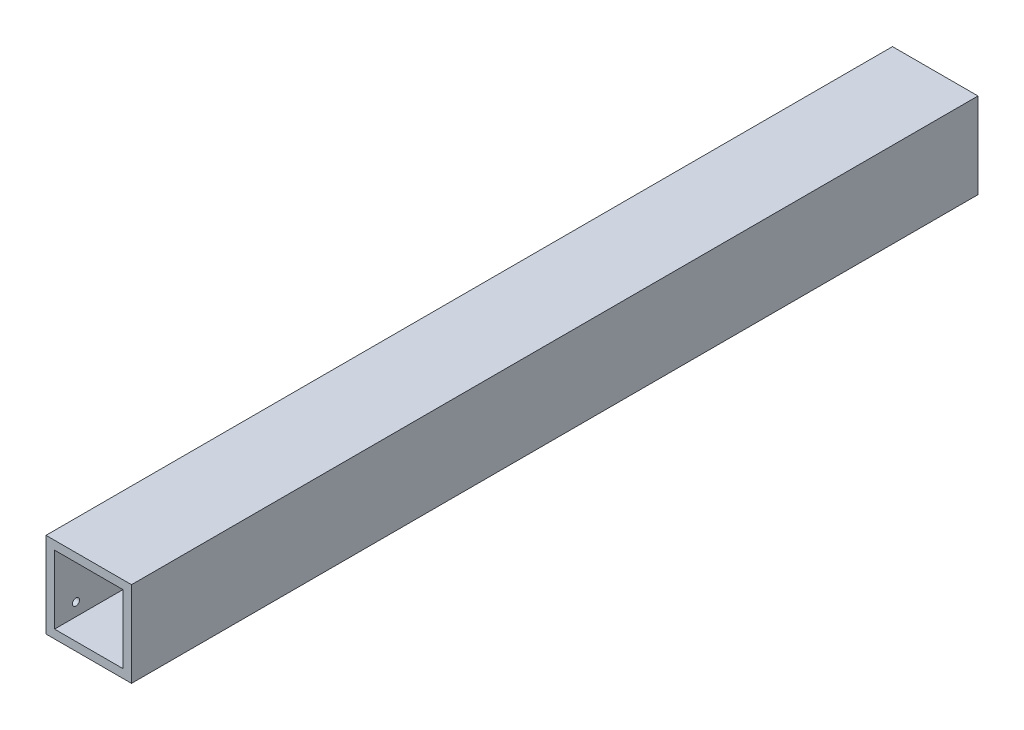
ISO-10303-21;
HEADER;
FILE_DESCRIPTION(('STEP AP214'),'2;1');
FILE_NAME('part.step','',(''),(''),'','','');
FILE_SCHEMA(('AUTOMOTIVE_DESIGN { 1 0 10303 214 1 1 1 1 }'));
ENDSEC;
DATA;
#1=APPLICATION_CONTEXT('core data for automotive mechanical design processes');
#2=APPLICATION_PROTOCOL_DEFINITION('international standard','automotive_design',2000,#1);
#3=PRODUCT_CONTEXT('',#1,'mechanical');
#4=PRODUCT('Part','Part','',(#3));
#5=PRODUCT_RELATED_PRODUCT_CATEGORY('part','',(#4));
#6=PRODUCT_DEFINITION_FORMATION('','',#4);
#7=PRODUCT_DEFINITION_CONTEXT('part definition',#1,'design');
#8=PRODUCT_DEFINITION('design','',#6,#7);
#9=PRODUCT_DEFINITION_SHAPE('','',#8);
#10=(LENGTH_UNIT() NAMED_UNIT(*) SI_UNIT(.MILLI.,.METRE.));
#11=(NAMED_UNIT(*) PLANE_ANGLE_UNIT() SI_UNIT($,.RADIAN.));
#12=(NAMED_UNIT(*) SI_UNIT($,.STERADIAN.) SOLID_ANGLE_UNIT());
#13=UNCERTAINTY_MEASURE_WITH_UNIT(LENGTH_MEASURE(1.E-05),#10,'distance_accuracy_value','');
#14=(GEOMETRIC_REPRESENTATION_CONTEXT(3) GLOBAL_UNCERTAINTY_ASSIGNED_CONTEXT((#13)) GLOBAL_UNIT_ASSIGNED_CONTEXT((#10,
#11,#12)) REPRESENTATION_CONTEXT('',''));
#15=CARTESIAN_POINT('',(0.,0.,0.));
#16=DIRECTION('',(0.,0.,1.));
#17=DIRECTION('',(1.,0.,0.));
#18=AXIS2_PLACEMENT_3D('',#15,#16,#17);
#19=CARTESIAN_POINT('',(0.,0.,396.));
#20=DIRECTION('',(0.,0.,1.));
#21=DIRECTION('',(1.,0.,0.));
#22=AXIS2_PLACEMENT_3D('',#19,#20,#21);
#23=PLANE('',#22);
#24=DIRECTION('',(0.,-1.,0.));
#25=VECTOR('',#24,1.);
#26=CARTESIAN_POINT('',(0.,0.,396.));
#27=LINE('',#26,#25);
#28=CARTESIAN_POINT('',(0.,40.,396.));
#29=VERTEX_POINT('',#28);
#30=CARTESIAN_POINT('',(0.,0.,396.));
#31=VERTEX_POINT('',#30);
#32=EDGE_CURVE('E169',#29,#31,#27,.T.);
#33=ORIENTED_EDGE('',*,*,#32,.T.);
#34=DIRECTION('',(1.,0.,0.));
#35=VECTOR('',#34,1.);
#36=CARTESIAN_POINT('',(0.,0.,396.));
#37=LINE('',#36,#35);
#38=CARTESIAN_POINT('',(40.,0.,396.));
#39=VERTEX_POINT('',#38);
#40=EDGE_CURVE('E172',#31,#39,#37,.T.);
#41=ORIENTED_EDGE('',*,*,#40,.T.);
#42=DIRECTION('',(0.,1.,0.));
#43=VECTOR('',#42,1.);
#44=CARTESIAN_POINT('',(40.,0.,396.));
#45=LINE('',#44,#43);
#46=CARTESIAN_POINT('',(40.,40.,396.));
#47=VERTEX_POINT('',#46);
#48=EDGE_CURVE('E175',#39,#47,#45,.T.);
#49=ORIENTED_EDGE('',*,*,#48,.T.);
#50=DIRECTION('',(-1.,0.,0.));
#51=VECTOR('',#50,1.);
#52=CARTESIAN_POINT('',(0.,40.,396.));
#53=LINE('',#52,#51);
#54=EDGE_CURVE('E177',#47,#29,#53,.T.);
#55=ORIENTED_EDGE('',*,*,#54,.T.);
#56=EDGE_LOOP('',(#33,#41,#49,#55));
#57=FACE_BOUND('',#56,.T.);
#58=DIRECTION('',(1.,0.,0.));
#59=VECTOR('',#58,1.);
#60=CARTESIAN_POINT('',(0.,4.,396.));
#61=LINE('',#60,#59);
#62=CARTESIAN_POINT('',(4.,4.,396.));
#63=VERTEX_POINT('',#62);
#64=CARTESIAN_POINT('',(36.,4.,396.));
#65=VERTEX_POINT('',#64);
#66=EDGE_CURVE('E139',#63,#65,#61,.T.);
#67=ORIENTED_EDGE('',*,*,#66,.F.);
#68=DIRECTION('',(0.,-1.,0.));
#69=VECTOR('',#68,1.);
#70=CARTESIAN_POINT('',(4.,40.,396.));
#71=LINE('',#70,#69);
#72=CARTESIAN_POINT('',(4.,36.,396.));
#73=VERTEX_POINT('',#72);
#74=EDGE_CURVE('E131',#73,#63,#71,.T.);
#75=ORIENTED_EDGE('',*,*,#74,.F.);
#76=DIRECTION('',(-1.,0.,0.));
#77=VECTOR('',#76,1.);
#78=CARTESIAN_POINT('',(0.,36.,396.));
#79=LINE('',#78,#77);
#80=CARTESIAN_POINT('',(36.,36.,396.));
#81=VERTEX_POINT('',#80);
#82=EDGE_CURVE('E153',#81,#73,#79,.T.);
#83=ORIENTED_EDGE('',*,*,#82,.F.);
#84=DIRECTION('',(0.,1.,0.));
#85=VECTOR('',#84,1.);
#86=CARTESIAN_POINT('',(36.,40.,396.));
#87=LINE('',#86,#85);
#88=EDGE_CURVE('E151',#65,#81,#87,.T.);
#89=ORIENTED_EDGE('',*,*,#88,.F.);
#90=EDGE_LOOP('',(#67,#75,#83,#89));
#91=FACE_BOUND('',#90,.T.);
#92=ADVANCED_FACE('F64',(#57,#91),#23,.T.);
#93=CARTESIAN_POINT('',(0.,0.,0.));
#94=DIRECTION('',(0.,0.,1.));
#95=DIRECTION('',(1.,0.,0.));
#96=AXIS2_PLACEMENT_3D('',#93,#94,#95);
#97=PLANE('',#96);
#98=DIRECTION('',(0.,-1.,0.));
#99=VECTOR('',#98,1.);
#100=CARTESIAN_POINT('',(0.,0.,0.));
#101=LINE('',#100,#99);
#102=CARTESIAN_POINT('',(0.,40.,0.));
#103=VERTEX_POINT('',#102);
#104=CARTESIAN_POINT('',(0.,0.,0.));
#105=VERTEX_POINT('',#104);
#106=EDGE_CURVE('E147',#103,#105,#101,.T.);
#107=ORIENTED_EDGE('',*,*,#106,.F.);
#108=DIRECTION('',(-1.,0.,0.));
#109=VECTOR('',#108,1.);
#110=CARTESIAN_POINT('',(0.,40.,0.));
#111=LINE('',#110,#109);
#112=CARTESIAN_POINT('',(40.,40.,0.));
#113=VERTEX_POINT('',#112);
#114=EDGE_CURVE('E173',#113,#103,#111,.T.);
#115=ORIENTED_EDGE('',*,*,#114,.F.);
#116=DIRECTION('',(0.,1.,0.));
#117=VECTOR('',#116,1.);
#118=CARTESIAN_POINT('',(40.,0.,0.));
#119=LINE('',#118,#117);
#120=CARTESIAN_POINT('',(40.,0.,0.));
#121=VERTEX_POINT('',#120);
#122=EDGE_CURVE('E184',#121,#113,#119,.T.);
#123=ORIENTED_EDGE('',*,*,#122,.F.);
#124=DIRECTION('',(1.,0.,0.));
#125=VECTOR('',#124,1.);
#126=CARTESIAN_POINT('',(0.,0.,0.));
#127=LINE('',#126,#125);
#128=EDGE_CURVE('E182',#105,#121,#127,.T.);
#129=ORIENTED_EDGE('',*,*,#128,.F.);
#130=EDGE_LOOP('',(#107,#115,#123,#129));
#131=FACE_BOUND('',#130,.T.);
#132=DIRECTION('',(0.,-1.,0.));
#133=VECTOR('',#132,1.);
#134=CARTESIAN_POINT('',(4.,40.,0.));
#135=LINE('',#134,#133);
#136=CARTESIAN_POINT('',(4.,36.,0.));
#137=VERTEX_POINT('',#136);
#138=CARTESIAN_POINT('',(4.,4.,0.));
#139=VERTEX_POINT('',#138);
#140=EDGE_CURVE('E89',#137,#139,#135,.T.);
#141=ORIENTED_EDGE('',*,*,#140,.T.);
#142=DIRECTION('',(1.,0.,0.));
#143=VECTOR('',#142,1.);
#144=CARTESIAN_POINT('',(0.,4.,0.));
#145=LINE('',#144,#143);
#146=CARTESIAN_POINT('',(36.,4.,0.));
#147=VERTEX_POINT('',#146);
#148=EDGE_CURVE('E146',#139,#147,#145,.T.);
#149=ORIENTED_EDGE('',*,*,#148,.T.);
#150=DIRECTION('',(0.,1.,0.));
#151=VECTOR('',#150,1.);
#152=CARTESIAN_POINT('',(36.,40.,0.));
#153=LINE('',#152,#151);
#154=CARTESIAN_POINT('',(36.,36.,0.));
#155=VERTEX_POINT('',#154);
#156=EDGE_CURVE('E161',#147,#155,#153,.T.);
#157=ORIENTED_EDGE('',*,*,#156,.T.);
#158=DIRECTION('',(-1.,0.,0.));
#159=VECTOR('',#158,1.);
#160=CARTESIAN_POINT('',(0.,36.,0.));
#161=LINE('',#160,#159);
#162=EDGE_CURVE('E140',#155,#137,#161,.T.);
#163=ORIENTED_EDGE('',*,*,#162,.T.);
#164=EDGE_LOOP('',(#141,#149,#157,#163));
#165=FACE_BOUND('',#164,.T.);
#166=ADVANCED_FACE('F299',(#131,#165),#97,.F.);
#167=CARTESIAN_POINT('',(0.,0.,396.));
#168=DIRECTION('',(1.,0.,0.));
#169=DIRECTION('',(0.,0.,-1.));
#170=AXIS2_PLACEMENT_3D('',#167,#168,#169);
#171=PLANE('',#170);
#172=CARTESIAN_POINT('',(0.,10.,386.));
#173=DIRECTION('',(-1.,0.,0.));
#174=DIRECTION('',(0.,0.,1.));
#175=AXIS2_PLACEMENT_3D('',#172,#173,#174);
#176=CIRCLE('',#175,2.025);
#177=CARTESIAN_POINT('',(0.,10.,388.025));
#178=VERTEX_POINT('',#177);
#179=EDGE_CURVE('E433',#178,#178,#176,.T.);
#180=ORIENTED_EDGE('',*,*,#179,.F.);
#181=EDGE_LOOP('',(#180));
#182=FACE_BOUND('',#181,.T.);
#183=CARTESIAN_POINT('',(0.,9.99999999999986,366.));
#184=DIRECTION('',(-1.,0.,0.));
#185=DIRECTION('',(0.,0.,1.));
#186=AXIS2_PLACEMENT_3D('',#183,#184,#185);
#187=CIRCLE('',#186,2.025);
#188=CARTESIAN_POINT('',(0.,9.99999999999986,368.025));
#189=VERTEX_POINT('',#188);
#190=EDGE_CURVE('E245',#189,#189,#187,.T.);
#191=ORIENTED_EDGE('',*,*,#190,.F.);
#192=EDGE_LOOP('',(#191));
#193=FACE_BOUND('',#192,.T.);
#194=CARTESIAN_POINT('',(0.,30.,386.));
#195=DIRECTION('',(-1.,0.,0.));
#196=DIRECTION('',(0.,0.,1.));
#197=AXIS2_PLACEMENT_3D('',#194,#195,#196);
#198=CIRCLE('',#197,2.025);
#199=CARTESIAN_POINT('',(0.,30.,388.025));
#200=VERTEX_POINT('',#199);
#201=EDGE_CURVE('E238',#200,#200,#198,.T.);
#202=ORIENTED_EDGE('',*,*,#201,.F.);
#203=EDGE_LOOP('',(#202));
#204=FACE_BOUND('',#203,.T.);
#205=CARTESIAN_POINT('',(0.,29.9999999999999,366.));
#206=DIRECTION('',(-1.,0.,0.));
#207=DIRECTION('',(0.,0.,1.));
#208=AXIS2_PLACEMENT_3D('',#205,#206,#207);
#209=CIRCLE('',#208,2.025);
#210=CARTESIAN_POINT('',(0.,29.9999999999999,368.025));
#211=VERTEX_POINT('',#210);
#212=EDGE_CURVE('E234',#211,#211,#209,.T.);
#213=ORIENTED_EDGE('',*,*,#212,.F.);
#214=EDGE_LOOP('',(#213));
#215=FACE_BOUND('',#214,.T.);
#216=CARTESIAN_POINT('',(0.,20.,30.));
#217=DIRECTION('',(-1.,0.,0.));
#218=DIRECTION('',(0.,0.,1.));
#219=AXIS2_PLACEMENT_3D('',#216,#217,#218);
#220=CIRCLE('',#219,3.025);
#221=CARTESIAN_POINT('',(0.,20.,33.025));
#222=VERTEX_POINT('',#221);
#223=EDGE_CURVE('E230',#222,#222,#220,.T.);
#224=ORIENTED_EDGE('',*,*,#223,.F.);
#225=EDGE_LOOP('',(#224));
#226=FACE_BOUND('',#225,.T.);
#227=CARTESIAN_POINT('',(0.,20.,80.));
#228=DIRECTION('',(-1.,0.,0.));
#229=DIRECTION('',(0.,0.,1.));
#230=AXIS2_PLACEMENT_3D('',#227,#228,#229);
#231=CIRCLE('',#230,3.025);
#232=CARTESIAN_POINT('',(0.,20.,83.025));
#233=VERTEX_POINT('',#232);
#234=EDGE_CURVE('E225',#233,#233,#231,.T.);
#235=ORIENTED_EDGE('',*,*,#234,.F.);
#236=EDGE_LOOP('',(#235));
#237=FACE_BOUND('',#236,.T.);
#238=CARTESIAN_POINT('',(0.,20.,130.));
#239=DIRECTION('',(-1.,0.,0.));
#240=DIRECTION('',(0.,0.,1.));
#241=AXIS2_PLACEMENT_3D('',#238,#239,#240);
#242=CIRCLE('',#241,3.025);
#243=CARTESIAN_POINT('',(0.,20.,133.025));
#244=VERTEX_POINT('',#243);
#245=EDGE_CURVE('E220',#244,#244,#242,.T.);
#246=ORIENTED_EDGE('',*,*,#245,.F.);
#247=EDGE_LOOP('',(#246));
#248=FACE_BOUND('',#247,.T.);
#249=CARTESIAN_POINT('',(0.,20.,180.));
#250=DIRECTION('',(-1.,0.,0.));
#251=DIRECTION('',(0.,0.,1.));
#252=AXIS2_PLACEMENT_3D('',#249,#250,#251);
#253=CIRCLE('',#252,3.025);
#254=CARTESIAN_POINT('',(0.,20.,183.025));
#255=VERTEX_POINT('',#254);
#256=EDGE_CURVE('E215',#255,#255,#253,.T.);
#257=ORIENTED_EDGE('',*,*,#256,.F.);
#258=EDGE_LOOP('',(#257));
#259=FACE_BOUND('',#258,.T.);
#260=CARTESIAN_POINT('',(0.,20.,230.));
#261=DIRECTION('',(-1.,0.,0.));
#262=DIRECTION('',(0.,0.,1.));
#263=AXIS2_PLACEMENT_3D('',#260,#261,#262);
#264=CIRCLE('',#263,3.025);
#265=CARTESIAN_POINT('',(0.,20.,233.025));
#266=VERTEX_POINT('',#265);
#267=EDGE_CURVE('E210',#266,#266,#264,.T.);
#268=ORIENTED_EDGE('',*,*,#267,.F.);
#269=EDGE_LOOP('',(#268));
#270=FACE_BOUND('',#269,.T.);
#271=CARTESIAN_POINT('',(0.,20.,280.));
#272=DIRECTION('',(-1.,0.,0.));
#273=DIRECTION('',(0.,0.,1.));
#274=AXIS2_PLACEMENT_3D('',#271,#272,#273);
#275=CIRCLE('',#274,3.025);
#276=CARTESIAN_POINT('',(0.,20.,283.025));
#277=VERTEX_POINT('',#276);
#278=EDGE_CURVE('E205',#277,#277,#275,.T.);
#279=ORIENTED_EDGE('',*,*,#278,.F.);
#280=EDGE_LOOP('',(#279));
#281=FACE_BOUND('',#280,.T.);
#282=CARTESIAN_POINT('',(0.,20.,330.));
#283=DIRECTION('',(-1.,0.,0.));
#284=DIRECTION('',(0.,0.,1.));
#285=AXIS2_PLACEMENT_3D('',#282,#283,#284);
#286=CIRCLE('',#285,3.025);
#287=CARTESIAN_POINT('',(0.,20.,333.025));
#288=VERTEX_POINT('',#287);
#289=EDGE_CURVE('E200',#288,#288,#286,.T.);
#290=ORIENTED_EDGE('',*,*,#289,.F.);
#291=EDGE_LOOP('',(#290));
#292=FACE_BOUND('',#291,.T.);
#293=ORIENTED_EDGE('',*,*,#106,.T.);
#294=DIRECTION('',(0.,0.,-1.));
#295=VECTOR('',#294,1.);
#296=CARTESIAN_POINT('',(0.,0.,396.));
#297=LINE('',#296,#295);
#298=EDGE_CURVE('E12',#31,#105,#297,.T.);
#299=ORIENTED_EDGE('',*,*,#298,.F.);
#300=ORIENTED_EDGE('',*,*,#32,.F.);
#301=DIRECTION('',(0.,0.,-1.));
#302=VECTOR('',#301,1.);
#303=CARTESIAN_POINT('',(0.,40.,396.));
#304=LINE('',#303,#302);
#305=EDGE_CURVE('E179',#29,#103,#304,.T.);
#306=ORIENTED_EDGE('',*,*,#305,.T.);
#307=EDGE_LOOP('',(#293,#299,#300,#306));
#308=FACE_BOUND('',#307,.T.);
#309=ADVANCED_FACE('F66',(#182,#193,#204,#215,#226,#237,#248,#259,#270,#281,#292,#308),#171,.F.);
#310=CARTESIAN_POINT('',(0.,0.,396.));
#311=DIRECTION('',(0.,1.,0.));
#312=DIRECTION('',(0.,0.,1.));
#313=AXIS2_PLACEMENT_3D('',#310,#311,#312);
#314=PLANE('',#313);
#315=ORIENTED_EDGE('',*,*,#128,.T.);
#316=DIRECTION('',(0.,0.,-1.));
#317=VECTOR('',#316,1.);
#318=CARTESIAN_POINT('',(40.,0.,396.));
#319=LINE('',#318,#317);
#320=EDGE_CURVE('E73',#39,#121,#319,.T.);
#321=ORIENTED_EDGE('',*,*,#320,.F.);
#322=ORIENTED_EDGE('',*,*,#40,.F.);
#323=ORIENTED_EDGE('',*,*,#298,.T.);
#324=EDGE_LOOP('',(#315,#321,#322,#323));
#325=FACE_BOUND('',#324,.T.);
#326=ADVANCED_FACE('F298',(#325),#314,.F.);
#327=CARTESIAN_POINT('',(40.,0.,396.));
#328=DIRECTION('',(-1.,0.,0.));
#329=DIRECTION('',(0.,0.,1.));
#330=AXIS2_PLACEMENT_3D('',#327,#328,#329);
#331=PLANE('',#330);
#332=ORIENTED_EDGE('',*,*,#122,.T.);
#333=DIRECTION('',(0.,0.,-1.));
#334=VECTOR('',#333,1.);
#335=CARTESIAN_POINT('',(40.,40.,396.));
#336=LINE('',#335,#334);
#337=EDGE_CURVE('E189',#47,#113,#336,.T.);
#338=ORIENTED_EDGE('',*,*,#337,.F.);
#339=ORIENTED_EDGE('',*,*,#48,.F.);
#340=ORIENTED_EDGE('',*,*,#320,.T.);
#341=EDGE_LOOP('',(#332,#338,#339,#340));
#342=FACE_BOUND('',#341,.T.);
#343=ADVANCED_FACE('F318',(#342),#331,.F.);
#344=CARTESIAN_POINT('',(0.,40.,396.));
#345=DIRECTION('',(0.,-1.,0.));
#346=DIRECTION('',(0.,0.,-1.));
#347=AXIS2_PLACEMENT_3D('',#344,#345,#346);
#348=PLANE('',#347);
#349=ORIENTED_EDGE('',*,*,#114,.T.);
#350=ORIENTED_EDGE('',*,*,#305,.F.);
#351=ORIENTED_EDGE('',*,*,#54,.F.);
#352=ORIENTED_EDGE('',*,*,#337,.T.);
#353=EDGE_LOOP('',(#349,#350,#351,#352));
#354=FACE_BOUND('',#353,.T.);
#355=ADVANCED_FACE('F316',(#354),#348,.F.);
#356=CARTESIAN_POINT('',(4.,40.,396.));
#357=DIRECTION('',(1.,0.,0.));
#358=DIRECTION('',(0.,0.,-1.));
#359=AXIS2_PLACEMENT_3D('',#356,#357,#358);
#360=PLANE('',#359);
#361=CARTESIAN_POINT('',(4.,10.,386.));
#362=DIRECTION('',(1.,0.,0.));
#363=DIRECTION('',(0.,0.,-1.));
#364=AXIS2_PLACEMENT_3D('',#361,#362,#363);
#365=CIRCLE('',#364,1.65);
#366=CARTESIAN_POINT('',(4.,10.,384.35));
#367=VERTEX_POINT('',#366);
#368=EDGE_CURVE('E68',#367,#367,#365,.T.);
#369=ORIENTED_EDGE('',*,*,#368,.F.);
#370=EDGE_LOOP('',(#369));
#371=FACE_BOUND('',#370,.T.);
#372=CARTESIAN_POINT('',(4.,9.99999999999986,366.));
#373=DIRECTION('',(1.,0.,0.));
#374=DIRECTION('',(0.,0.,-1.));
#375=AXIS2_PLACEMENT_3D('',#372,#373,#374);
#376=CIRCLE('',#375,1.65);
#377=CARTESIAN_POINT('',(4.,9.99999999999986,364.35));
#378=VERTEX_POINT('',#377);
#379=EDGE_CURVE('E236',#378,#378,#376,.T.);
#380=ORIENTED_EDGE('',*,*,#379,.F.);
#381=EDGE_LOOP('',(#380));
#382=FACE_BOUND('',#381,.T.);
#383=CARTESIAN_POINT('',(4.,30.,386.));
#384=DIRECTION('',(1.,0.,0.));
#385=DIRECTION('',(0.,0.,-1.));
#386=AXIS2_PLACEMENT_3D('',#383,#384,#385);
#387=CIRCLE('',#386,1.65);
#388=CARTESIAN_POINT('',(4.,30.,384.35));
#389=VERTEX_POINT('',#388);
#390=EDGE_CURVE('E232',#389,#389,#387,.T.);
#391=ORIENTED_EDGE('',*,*,#390,.F.);
#392=EDGE_LOOP('',(#391));
#393=FACE_BOUND('',#392,.T.);
#394=CARTESIAN_POINT('',(4.,29.9999999999999,366.));
#395=DIRECTION('',(1.,0.,0.));
#396=DIRECTION('',(0.,0.,-1.));
#397=AXIS2_PLACEMENT_3D('',#394,#395,#396);
#398=CIRCLE('',#397,1.65);
#399=CARTESIAN_POINT('',(4.,29.9999999999999,364.35));
#400=VERTEX_POINT('',#399);
#401=EDGE_CURVE('E227',#400,#400,#398,.T.);
#402=ORIENTED_EDGE('',*,*,#401,.F.);
#403=EDGE_LOOP('',(#402));
#404=FACE_BOUND('',#403,.T.);
#405=CARTESIAN_POINT('',(4.,20.,30.));
#406=DIRECTION('',(1.,0.,0.));
#407=DIRECTION('',(0.,0.,-1.));
#408=AXIS2_PLACEMENT_3D('',#405,#406,#407);
#409=CIRCLE('',#408,2.5);
#410=CARTESIAN_POINT('',(4.,20.,27.5));
#411=VERTEX_POINT('',#410);
#412=EDGE_CURVE('E222',#411,#411,#409,.T.);
#413=ORIENTED_EDGE('',*,*,#412,.F.);
#414=EDGE_LOOP('',(#413));
#415=FACE_BOUND('',#414,.T.);
#416=CARTESIAN_POINT('',(4.,20.,80.));
#417=DIRECTION('',(1.,0.,0.));
#418=DIRECTION('',(0.,0.,-1.));
#419=AXIS2_PLACEMENT_3D('',#416,#417,#418);
#420=CIRCLE('',#419,2.5);
#421=CARTESIAN_POINT('',(4.,20.,77.5));
#422=VERTEX_POINT('',#421);
#423=EDGE_CURVE('E217',#422,#422,#420,.T.);
#424=ORIENTED_EDGE('',*,*,#423,.F.);
#425=EDGE_LOOP('',(#424));
#426=FACE_BOUND('',#425,.T.);
#427=CARTESIAN_POINT('',(4.,20.,130.));
#428=DIRECTION('',(1.,0.,0.));
#429=DIRECTION('',(0.,0.,-1.));
#430=AXIS2_PLACEMENT_3D('',#427,#428,#429);
#431=CIRCLE('',#430,2.5);
#432=CARTESIAN_POINT('',(4.,20.,127.5));
#433=VERTEX_POINT('',#432);
#434=EDGE_CURVE('E212',#433,#433,#431,.T.);
#435=ORIENTED_EDGE('',*,*,#434,.F.);
#436=EDGE_LOOP('',(#435));
#437=FACE_BOUND('',#436,.T.);
#438=CARTESIAN_POINT('',(4.,20.,180.));
#439=DIRECTION('',(1.,0.,0.));
#440=DIRECTION('',(0.,0.,-1.));
#441=AXIS2_PLACEMENT_3D('',#438,#439,#440);
#442=CIRCLE('',#441,2.5);
#443=CARTESIAN_POINT('',(4.,20.,177.5));
#444=VERTEX_POINT('',#443);
#445=EDGE_CURVE('E207',#444,#444,#442,.T.);
#446=ORIENTED_EDGE('',*,*,#445,.F.);
#447=EDGE_LOOP('',(#446));
#448=FACE_BOUND('',#447,.T.);
#449=CARTESIAN_POINT('',(4.,20.,230.));
#450=DIRECTION('',(1.,0.,0.));
#451=DIRECTION('',(0.,0.,-1.));
#452=AXIS2_PLACEMENT_3D('',#449,#450,#451);
#453=CIRCLE('',#452,2.5);
#454=CARTESIAN_POINT('',(4.,20.,227.5));
#455=VERTEX_POINT('',#454);
#456=EDGE_CURVE('E202',#455,#455,#453,.T.);
#457=ORIENTED_EDGE('',*,*,#456,.F.);
#458=EDGE_LOOP('',(#457));
#459=FACE_BOUND('',#458,.T.);
#460=CARTESIAN_POINT('',(4.,20.,280.));
#461=DIRECTION('',(1.,0.,0.));
#462=DIRECTION('',(0.,0.,-1.));
#463=AXIS2_PLACEMENT_3D('',#460,#461,#462);
#464=CIRCLE('',#463,2.5);
#465=CARTESIAN_POINT('',(4.,20.,277.5));
#466=VERTEX_POINT('',#465);
#467=EDGE_CURVE('E197',#466,#466,#464,.T.);
#468=ORIENTED_EDGE('',*,*,#467,.F.);
#469=EDGE_LOOP('',(#468));
#470=FACE_BOUND('',#469,.T.);
#471=CARTESIAN_POINT('',(4.,20.,330.));
#472=DIRECTION('',(1.,0.,0.));
#473=DIRECTION('',(0.,0.,-1.));
#474=AXIS2_PLACEMENT_3D('',#471,#472,#473);
#475=CIRCLE('',#474,2.5);
#476=CARTESIAN_POINT('',(4.,20.,327.5));
#477=VERTEX_POINT('',#476);
#478=EDGE_CURVE('E159',#477,#477,#475,.T.);
#479=ORIENTED_EDGE('',*,*,#478,.F.);
#480=EDGE_LOOP('',(#479));
#481=FACE_BOUND('',#480,.T.);
#482=ORIENTED_EDGE('',*,*,#140,.F.);
#483=DIRECTION('',(0.,0.,-1.));
#484=VECTOR('',#483,1.);
#485=CARTESIAN_POINT('',(4.,36.,396.));
#486=LINE('',#485,#484);
#487=EDGE_CURVE('E135',#73,#137,#486,.T.);
#488=ORIENTED_EDGE('',*,*,#487,.F.);
#489=ORIENTED_EDGE('',*,*,#74,.T.);
#490=DIRECTION('',(0.,0.,-1.));
#491=VECTOR('',#490,1.);
#492=CARTESIAN_POINT('',(4.,4.,396.));
#493=LINE('',#492,#491);
#494=EDGE_CURVE('E134',#63,#139,#493,.T.);
#495=ORIENTED_EDGE('',*,*,#494,.T.);
#496=EDGE_LOOP('',(#482,#488,#489,#495));
#497=FACE_BOUND('',#496,.T.);
#498=ADVANCED_FACE('F133',(#371,#382,#393,#404,#415,#426,#437,#448,#459,#470,#481,#497),#360,.T.);
#499=CARTESIAN_POINT('',(0.,4.,396.));
#500=DIRECTION('',(0.,1.,0.));
#501=DIRECTION('',(0.,0.,1.));
#502=AXIS2_PLACEMENT_3D('',#499,#500,#501);
#503=PLANE('',#502);
#504=ORIENTED_EDGE('',*,*,#148,.F.);
#505=ORIENTED_EDGE('',*,*,#494,.F.);
#506=ORIENTED_EDGE('',*,*,#66,.T.);
#507=DIRECTION('',(0.,0.,-1.));
#508=VECTOR('',#507,1.);
#509=CARTESIAN_POINT('',(36.,4.,396.));
#510=LINE('',#509,#508);
#511=EDGE_CURVE('E148',#65,#147,#510,.T.);
#512=ORIENTED_EDGE('',*,*,#511,.T.);
#513=EDGE_LOOP('',(#504,#505,#506,#512));
#514=FACE_BOUND('',#513,.T.);
#515=ADVANCED_FACE('F143',(#514),#503,.T.);
#516=CARTESIAN_POINT('',(36.,40.,396.));
#517=DIRECTION('',(-1.,0.,0.));
#518=DIRECTION('',(0.,0.,1.));
#519=AXIS2_PLACEMENT_3D('',#516,#517,#518);
#520=PLANE('',#519);
#521=ORIENTED_EDGE('',*,*,#156,.F.);
#522=ORIENTED_EDGE('',*,*,#511,.F.);
#523=ORIENTED_EDGE('',*,*,#88,.T.);
#524=DIRECTION('',(0.,0.,-1.));
#525=VECTOR('',#524,1.);
#526=CARTESIAN_POINT('',(36.,36.,396.));
#527=LINE('',#526,#525);
#528=EDGE_CURVE('E81',#81,#155,#527,.T.);
#529=ORIENTED_EDGE('',*,*,#528,.T.);
#530=EDGE_LOOP('',(#521,#522,#523,#529));
#531=FACE_BOUND('',#530,.T.);
#532=ADVANCED_FACE('F338',(#531),#520,.T.);
#533=CARTESIAN_POINT('',(0.,36.,396.));
#534=DIRECTION('',(0.,-1.,0.));
#535=DIRECTION('',(0.,0.,-1.));
#536=AXIS2_PLACEMENT_3D('',#533,#534,#535);
#537=PLANE('',#536);
#538=ORIENTED_EDGE('',*,*,#162,.F.);
#539=ORIENTED_EDGE('',*,*,#528,.F.);
#540=ORIENTED_EDGE('',*,*,#82,.T.);
#541=ORIENTED_EDGE('',*,*,#487,.T.);
#542=EDGE_LOOP('',(#538,#539,#540,#541));
#543=FACE_BOUND('',#542,.T.);
#544=ADVANCED_FACE('F341',(#543),#537,.T.);
#545=CARTESIAN_POINT('',(0.,20.,330.));
#546=DIRECTION('',(-1.,0.,0.));
#547=DIRECTION('',(0.,0.,1.));
#548=AXIS2_PLACEMENT_3D('',#545,#546,#547);
#549=CYLINDRICAL_SURFACE('',#548,2.5);
#550=ORIENTED_EDGE('',*,*,#478,.T.);
#551=EDGE_LOOP('',(#550));
#552=FACE_BOUND('',#551,.T.);
#553=CARTESIAN_POINT('',(0.303108891324556,20.,330.));
#554=DIRECTION('',(-1.,0.,0.));
#555=DIRECTION('',(0.,0.,1.));
#556=AXIS2_PLACEMENT_3D('',#553,#554,#555);
#557=CIRCLE('',#556,2.5);
#558=CARTESIAN_POINT('',(0.303108891324556,20.,332.5));
#559=VERTEX_POINT('',#558);
#560=EDGE_CURVE('E196',#559,#559,#557,.T.);
#561=ORIENTED_EDGE('',*,*,#560,.T.);
#562=EDGE_LOOP('',(#561));
#563=FACE_BOUND('',#562,.T.);
#564=ADVANCED_FACE('F287',(#552,#563),#549,.F.);
#565=CARTESIAN_POINT('',(0.,20.,330.));
#566=DIRECTION('',(-1.,0.,0.));
#567=DIRECTION('',(0.,0.,1.));
#568=AXIS2_PLACEMENT_3D('',#565,#566,#567);
#569=CONICAL_SURFACE('',#568,3.025,1.0471975511966);
#570=ORIENTED_EDGE('',*,*,#560,.F.);
#571=EDGE_LOOP('',(#570));
#572=FACE_BOUND('',#571,.T.);
#573=ORIENTED_EDGE('',*,*,#289,.T.);
#574=EDGE_LOOP('',(#573));
#575=FACE_BOUND('',#574,.T.);
#576=ADVANCED_FACE('F289',(#572,#575),#569,.F.);
#577=CARTESIAN_POINT('',(0.,20.,280.));
#578=DIRECTION('',(-1.,0.,0.));
#579=DIRECTION('',(0.,0.,1.));
#580=AXIS2_PLACEMENT_3D('',#577,#578,#579);
#581=CYLINDRICAL_SURFACE('',#580,2.5);
#582=ORIENTED_EDGE('',*,*,#467,.T.);
#583=EDGE_LOOP('',(#582));
#584=FACE_BOUND('',#583,.T.);
#585=CARTESIAN_POINT('',(0.303108891324556,20.,280.));
#586=DIRECTION('',(-1.,0.,0.));
#587=DIRECTION('',(0.,0.,1.));
#588=AXIS2_PLACEMENT_3D('',#585,#586,#587);
#589=CIRCLE('',#588,2.5);
#590=CARTESIAN_POINT('',(0.303108891324556,20.,282.5));
#591=VERTEX_POINT('',#590);
#592=EDGE_CURVE('E201',#591,#591,#589,.T.);
#593=ORIENTED_EDGE('',*,*,#592,.T.);
#594=EDGE_LOOP('',(#593));
#595=FACE_BOUND('',#594,.T.);
#596=ADVANCED_FACE('F292',(#584,#595),#581,.F.);
#597=CARTESIAN_POINT('',(0.,20.,280.));
#598=DIRECTION('',(-1.,0.,0.));
#599=DIRECTION('',(0.,0.,1.));
#600=AXIS2_PLACEMENT_3D('',#597,#598,#599);
#601=CONICAL_SURFACE('',#600,3.025,1.0471975511966);
#602=ORIENTED_EDGE('',*,*,#592,.F.);
#603=EDGE_LOOP('',(#602));
#604=FACE_BOUND('',#603,.T.);
#605=ORIENTED_EDGE('',*,*,#278,.T.);
#606=EDGE_LOOP('',(#605));
#607=FACE_BOUND('',#606,.T.);
#608=ADVANCED_FACE('F350',(#604,#607),#601,.F.);
#609=CARTESIAN_POINT('',(0.,20.,230.));
#610=DIRECTION('',(-1.,0.,0.));
#611=DIRECTION('',(0.,0.,1.));
#612=AXIS2_PLACEMENT_3D('',#609,#610,#611);
#613=CYLINDRICAL_SURFACE('',#612,2.5);
#614=ORIENTED_EDGE('',*,*,#456,.T.);
#615=EDGE_LOOP('',(#614));
#616=FACE_BOUND('',#615,.T.);
#617=CARTESIAN_POINT('',(0.303108891324556,20.,230.));
#618=DIRECTION('',(-1.,0.,0.));
#619=DIRECTION('',(0.,0.,1.));
#620=AXIS2_PLACEMENT_3D('',#617,#618,#619);
#621=CIRCLE('',#620,2.5);
#622=CARTESIAN_POINT('',(0.303108891324556,20.,232.5));
#623=VERTEX_POINT('',#622);
#624=EDGE_CURVE('E206',#623,#623,#621,.T.);
#625=ORIENTED_EDGE('',*,*,#624,.T.);
#626=EDGE_LOOP('',(#625));
#627=FACE_BOUND('',#626,.T.);
#628=ADVANCED_FACE('F354',(#616,#627),#613,.F.);
#629=CARTESIAN_POINT('',(0.,20.,230.));
#630=DIRECTION('',(-1.,0.,0.));
#631=DIRECTION('',(0.,0.,1.));
#632=AXIS2_PLACEMENT_3D('',#629,#630,#631);
#633=CONICAL_SURFACE('',#632,3.025,1.0471975511966);
#634=ORIENTED_EDGE('',*,*,#624,.F.);
#635=EDGE_LOOP('',(#634));
#636=FACE_BOUND('',#635,.T.);
#637=ORIENTED_EDGE('',*,*,#267,.T.);
#638=EDGE_LOOP('',(#637));
#639=FACE_BOUND('',#638,.T.);
#640=ADVANCED_FACE('F358',(#636,#639),#633,.F.);
#641=CARTESIAN_POINT('',(0.,20.,180.));
#642=DIRECTION('',(-1.,0.,0.));
#643=DIRECTION('',(0.,0.,1.));
#644=AXIS2_PLACEMENT_3D('',#641,#642,#643);
#645=CYLINDRICAL_SURFACE('',#644,2.5);
#646=ORIENTED_EDGE('',*,*,#445,.T.);
#647=EDGE_LOOP('',(#646));
#648=FACE_BOUND('',#647,.T.);
#649=CARTESIAN_POINT('',(0.303108891324556,20.,180.));
#650=DIRECTION('',(-1.,0.,0.));
#651=DIRECTION('',(0.,0.,1.));
#652=AXIS2_PLACEMENT_3D('',#649,#650,#651);
#653=CIRCLE('',#652,2.5);
#654=CARTESIAN_POINT('',(0.303108891324556,20.,182.5));
#655=VERTEX_POINT('',#654);
#656=EDGE_CURVE('E211',#655,#655,#653,.T.);
#657=ORIENTED_EDGE('',*,*,#656,.T.);
#658=EDGE_LOOP('',(#657));
#659=FACE_BOUND('',#658,.T.);
#660=ADVANCED_FACE('F362',(#648,#659),#645,.F.);
#661=CARTESIAN_POINT('',(0.,20.,180.));
#662=DIRECTION('',(-1.,0.,0.));
#663=DIRECTION('',(0.,0.,1.));
#664=AXIS2_PLACEMENT_3D('',#661,#662,#663);
#665=CONICAL_SURFACE('',#664,3.025,1.0471975511966);
#666=ORIENTED_EDGE('',*,*,#656,.F.);
#667=EDGE_LOOP('',(#666));
#668=FACE_BOUND('',#667,.T.);
#669=ORIENTED_EDGE('',*,*,#256,.T.);
#670=EDGE_LOOP('',(#669));
#671=FACE_BOUND('',#670,.T.);
#672=ADVANCED_FACE('F366',(#668,#671),#665,.F.);
#673=CARTESIAN_POINT('',(0.,20.,130.));
#674=DIRECTION('',(-1.,0.,0.));
#675=DIRECTION('',(0.,0.,1.));
#676=AXIS2_PLACEMENT_3D('',#673,#674,#675);
#677=CYLINDRICAL_SURFACE('',#676,2.5);
#678=ORIENTED_EDGE('',*,*,#434,.T.);
#679=EDGE_LOOP('',(#678));
#680=FACE_BOUND('',#679,.T.);
#681=CARTESIAN_POINT('',(0.303108891324556,20.,130.));
#682=DIRECTION('',(-1.,0.,0.));
#683=DIRECTION('',(0.,0.,1.));
#684=AXIS2_PLACEMENT_3D('',#681,#682,#683);
#685=CIRCLE('',#684,2.5);
#686=CARTESIAN_POINT('',(0.303108891324556,20.,132.5));
#687=VERTEX_POINT('',#686);
#688=EDGE_CURVE('E216',#687,#687,#685,.T.);
#689=ORIENTED_EDGE('',*,*,#688,.T.);
#690=EDGE_LOOP('',(#689));
#691=FACE_BOUND('',#690,.T.);
#692=ADVANCED_FACE('F370',(#680,#691),#677,.F.);
#693=CARTESIAN_POINT('',(0.,20.,130.));
#694=DIRECTION('',(-1.,0.,0.));
#695=DIRECTION('',(0.,0.,1.));
#696=AXIS2_PLACEMENT_3D('',#693,#694,#695);
#697=CONICAL_SURFACE('',#696,3.025,1.0471975511966);
#698=ORIENTED_EDGE('',*,*,#688,.F.);
#699=EDGE_LOOP('',(#698));
#700=FACE_BOUND('',#699,.T.);
#701=ORIENTED_EDGE('',*,*,#245,.T.);
#702=EDGE_LOOP('',(#701));
#703=FACE_BOUND('',#702,.T.);
#704=ADVANCED_FACE('F374',(#700,#703),#697,.F.);
#705=CARTESIAN_POINT('',(0.,20.,80.));
#706=DIRECTION('',(-1.,0.,0.));
#707=DIRECTION('',(0.,0.,1.));
#708=AXIS2_PLACEMENT_3D('',#705,#706,#707);
#709=CYLINDRICAL_SURFACE('',#708,2.5);
#710=ORIENTED_EDGE('',*,*,#423,.T.);
#711=EDGE_LOOP('',(#710));
#712=FACE_BOUND('',#711,.T.);
#713=CARTESIAN_POINT('',(0.303108891324556,20.,80.));
#714=DIRECTION('',(-1.,0.,0.));
#715=DIRECTION('',(0.,0.,1.));
#716=AXIS2_PLACEMENT_3D('',#713,#714,#715);
#717=CIRCLE('',#716,2.5);
#718=CARTESIAN_POINT('',(0.303108891324556,20.,82.5));
#719=VERTEX_POINT('',#718);
#720=EDGE_CURVE('E221',#719,#719,#717,.T.);
#721=ORIENTED_EDGE('',*,*,#720,.T.);
#722=EDGE_LOOP('',(#721));
#723=FACE_BOUND('',#722,.T.);
#724=ADVANCED_FACE('F378',(#712,#723),#709,.F.);
#725=CARTESIAN_POINT('',(0.,20.,80.));
#726=DIRECTION('',(-1.,0.,0.));
#727=DIRECTION('',(0.,0.,1.));
#728=AXIS2_PLACEMENT_3D('',#725,#726,#727);
#729=CONICAL_SURFACE('',#728,3.025,1.0471975511966);
#730=ORIENTED_EDGE('',*,*,#720,.F.);
#731=EDGE_LOOP('',(#730));
#732=FACE_BOUND('',#731,.T.);
#733=ORIENTED_EDGE('',*,*,#234,.T.);
#734=EDGE_LOOP('',(#733));
#735=FACE_BOUND('',#734,.T.);
#736=ADVANCED_FACE('F382',(#732,#735),#729,.F.);
#737=CARTESIAN_POINT('',(0.,20.,30.));
#738=DIRECTION('',(-1.,0.,0.));
#739=DIRECTION('',(0.,0.,1.));
#740=AXIS2_PLACEMENT_3D('',#737,#738,#739);
#741=CYLINDRICAL_SURFACE('',#740,2.5);
#742=ORIENTED_EDGE('',*,*,#412,.T.);
#743=EDGE_LOOP('',(#742));
#744=FACE_BOUND('',#743,.T.);
#745=CARTESIAN_POINT('',(0.303108891324556,20.,30.));
#746=DIRECTION('',(-1.,0.,0.));
#747=DIRECTION('',(0.,0.,1.));
#748=AXIS2_PLACEMENT_3D('',#745,#746,#747);
#749=CIRCLE('',#748,2.5);
#750=CARTESIAN_POINT('',(0.303108891324556,20.,32.5));
#751=VERTEX_POINT('',#750);
#752=EDGE_CURVE('E226',#751,#751,#749,.T.);
#753=ORIENTED_EDGE('',*,*,#752,.T.);
#754=EDGE_LOOP('',(#753));
#755=FACE_BOUND('',#754,.T.);
#756=ADVANCED_FACE('F386',(#744,#755),#741,.F.);
#757=CARTESIAN_POINT('',(0.,20.,30.));
#758=DIRECTION('',(-1.,0.,0.));
#759=DIRECTION('',(0.,0.,1.));
#760=AXIS2_PLACEMENT_3D('',#757,#758,#759);
#761=CONICAL_SURFACE('',#760,3.025,1.0471975511966);
#762=ORIENTED_EDGE('',*,*,#752,.F.);
#763=EDGE_LOOP('',(#762));
#764=FACE_BOUND('',#763,.T.);
#765=ORIENTED_EDGE('',*,*,#223,.T.);
#766=EDGE_LOOP('',(#765));
#767=FACE_BOUND('',#766,.T.);
#768=ADVANCED_FACE('F390',(#764,#767),#761,.F.);
#769=CARTESIAN_POINT('',(0.,29.9999999999999,366.));
#770=DIRECTION('',(-1.,0.,0.));
#771=DIRECTION('',(0.,0.,1.));
#772=AXIS2_PLACEMENT_3D('',#769,#770,#771);
#773=CYLINDRICAL_SURFACE('',#772,1.65);
#774=ORIENTED_EDGE('',*,*,#401,.T.);
#775=EDGE_LOOP('',(#774));
#776=FACE_BOUND('',#775,.T.);
#777=CARTESIAN_POINT('',(0.216506350946111,29.9999999999999,366.));
#778=DIRECTION('',(-1.,0.,0.));
#779=DIRECTION('',(0.,0.,1.));
#780=AXIS2_PLACEMENT_3D('',#777,#778,#779);
#781=CIRCLE('',#780,1.65);
#782=CARTESIAN_POINT('',(0.216506350946111,29.9999999999999,367.65));
#783=VERTEX_POINT('',#782);
#784=EDGE_CURVE('E231',#783,#783,#781,.T.);
#785=ORIENTED_EDGE('',*,*,#784,.T.);
#786=EDGE_LOOP('',(#785));
#787=FACE_BOUND('',#786,.T.);
#788=ADVANCED_FACE('F394',(#776,#787),#773,.F.);
#789=CARTESIAN_POINT('',(0.,29.9999999999999,366.));
#790=DIRECTION('',(-1.,0.,0.));
#791=DIRECTION('',(0.,0.,1.));
#792=AXIS2_PLACEMENT_3D('',#789,#790,#791);
#793=CONICAL_SURFACE('',#792,2.025,1.0471975511966);
#794=ORIENTED_EDGE('',*,*,#784,.F.);
#795=EDGE_LOOP('',(#794));
#796=FACE_BOUND('',#795,.T.);
#797=ORIENTED_EDGE('',*,*,#212,.T.);
#798=EDGE_LOOP('',(#797));
#799=FACE_BOUND('',#798,.T.);
#800=ADVANCED_FACE('F398',(#796,#799),#793,.F.);
#801=CARTESIAN_POINT('',(0.,30.,386.));
#802=DIRECTION('',(-1.,0.,0.));
#803=DIRECTION('',(0.,0.,1.));
#804=AXIS2_PLACEMENT_3D('',#801,#802,#803);
#805=CYLINDRICAL_SURFACE('',#804,1.65);
#806=ORIENTED_EDGE('',*,*,#390,.T.);
#807=EDGE_LOOP('',(#806));
#808=FACE_BOUND('',#807,.T.);
#809=CARTESIAN_POINT('',(0.216506350946111,30.,386.));
#810=DIRECTION('',(-1.,0.,0.));
#811=DIRECTION('',(0.,0.,1.));
#812=AXIS2_PLACEMENT_3D('',#809,#810,#811);
#813=CIRCLE('',#812,1.65);
#814=CARTESIAN_POINT('',(0.216506350946111,30.,387.65));
#815=VERTEX_POINT('',#814);
#816=EDGE_CURVE('E235',#815,#815,#813,.T.);
#817=ORIENTED_EDGE('',*,*,#816,.T.);
#818=EDGE_LOOP('',(#817));
#819=FACE_BOUND('',#818,.T.);
#820=ADVANCED_FACE('F402',(#808,#819),#805,.F.);
#821=CARTESIAN_POINT('',(0.,30.,386.));
#822=DIRECTION('',(-1.,0.,0.));
#823=DIRECTION('',(0.,0.,1.));
#824=AXIS2_PLACEMENT_3D('',#821,#822,#823);
#825=CONICAL_SURFACE('',#824,2.025,1.0471975511966);
#826=ORIENTED_EDGE('',*,*,#816,.F.);
#827=EDGE_LOOP('',(#826));
#828=FACE_BOUND('',#827,.T.);
#829=ORIENTED_EDGE('',*,*,#201,.T.);
#830=EDGE_LOOP('',(#829));
#831=FACE_BOUND('',#830,.T.);
#832=ADVANCED_FACE('F406',(#828,#831),#825,.F.);
#833=CARTESIAN_POINT('',(0.,9.99999999999986,366.));
#834=DIRECTION('',(-1.,0.,0.));
#835=DIRECTION('',(0.,0.,1.));
#836=AXIS2_PLACEMENT_3D('',#833,#834,#835);
#837=CYLINDRICAL_SURFACE('',#836,1.65);
#838=ORIENTED_EDGE('',*,*,#379,.T.);
#839=EDGE_LOOP('',(#838));
#840=FACE_BOUND('',#839,.T.);
#841=CARTESIAN_POINT('',(0.216506350946111,9.99999999999986,366.));
#842=DIRECTION('',(-1.,0.,0.));
#843=DIRECTION('',(0.,0.,1.));
#844=AXIS2_PLACEMENT_3D('',#841,#842,#843);
#845=CIRCLE('',#844,1.65);
#846=CARTESIAN_POINT('',(0.216506350946111,9.99999999999986,367.65));
#847=VERTEX_POINT('',#846);
#848=EDGE_CURVE('E239',#847,#847,#845,.T.);
#849=ORIENTED_EDGE('',*,*,#848,.T.);
#850=EDGE_LOOP('',(#849));
#851=FACE_BOUND('',#850,.T.);
#852=ADVANCED_FACE('F410',(#840,#851),#837,.F.);
#853=CARTESIAN_POINT('',(0.,9.99999999999986,366.));
#854=DIRECTION('',(-1.,0.,0.));
#855=DIRECTION('',(0.,0.,1.));
#856=AXIS2_PLACEMENT_3D('',#853,#854,#855);
#857=CONICAL_SURFACE('',#856,2.025,1.0471975511966);
#858=ORIENTED_EDGE('',*,*,#848,.F.);
#859=EDGE_LOOP('',(#858));
#860=FACE_BOUND('',#859,.T.);
#861=ORIENTED_EDGE('',*,*,#190,.T.);
#862=EDGE_LOOP('',(#861));
#863=FACE_BOUND('',#862,.T.);
#864=ADVANCED_FACE('F414',(#860,#863),#857,.F.);
#865=CARTESIAN_POINT('',(0.,10.,386.));
#866=DIRECTION('',(-1.,0.,0.));
#867=DIRECTION('',(0.,0.,1.));
#868=AXIS2_PLACEMENT_3D('',#865,#866,#867);
#869=CYLINDRICAL_SURFACE('',#868,1.65);
#870=ORIENTED_EDGE('',*,*,#368,.T.);
#871=EDGE_LOOP('',(#870));
#872=FACE_BOUND('',#871,.T.);
#873=CARTESIAN_POINT('',(0.216506350946111,10.,386.));
#874=DIRECTION('',(-1.,0.,0.));
#875=DIRECTION('',(0.,0.,1.));
#876=AXIS2_PLACEMENT_3D('',#873,#874,#875);
#877=CIRCLE('',#876,1.65);
#878=CARTESIAN_POINT('',(0.216506350946111,10.,387.65));
#879=VERTEX_POINT('',#878);
#880=EDGE_CURVE('E430',#879,#879,#877,.T.);
#881=ORIENTED_EDGE('',*,*,#880,.T.);
#882=EDGE_LOOP('',(#881));
#883=FACE_BOUND('',#882,.T.);
#884=ADVANCED_FACE('F417',(#872,#883),#869,.F.);
#885=CARTESIAN_POINT('',(0.,10.,386.));
#886=DIRECTION('',(-1.,0.,0.));
#887=DIRECTION('',(0.,0.,1.));
#888=AXIS2_PLACEMENT_3D('',#885,#886,#887);
#889=CONICAL_SURFACE('',#888,2.025,1.0471975511966);
#890=ORIENTED_EDGE('',*,*,#880,.F.);
#891=EDGE_LOOP('',(#890));
#892=FACE_BOUND('',#891,.T.);
#893=ORIENTED_EDGE('',*,*,#179,.T.);
#894=EDGE_LOOP('',(#893));
#895=FACE_BOUND('',#894,.T.);
#896=ADVANCED_FACE('F421',(#892,#895),#889,.F.);
#897=CLOSED_SHELL('',(#92,#166,#309,#326,#343,#355,#498,#515,#532,#544,#564,#576,#596,#608,#628,
#640,#660,#672,#692,#704,#724,#736,#756,#768,#788,#800,#820,#832,#852,#864,#884,#896));
#898=MANIFOLD_SOLID_BREP('B2',#897);
#899=ADVANCED_BREP_SHAPE_REPRESENTATION('',(#18,#898),#14);
#900=SHAPE_DEFINITION_REPRESENTATION(#9,#899);
ENDSEC;
END-ISO-10303-21;
